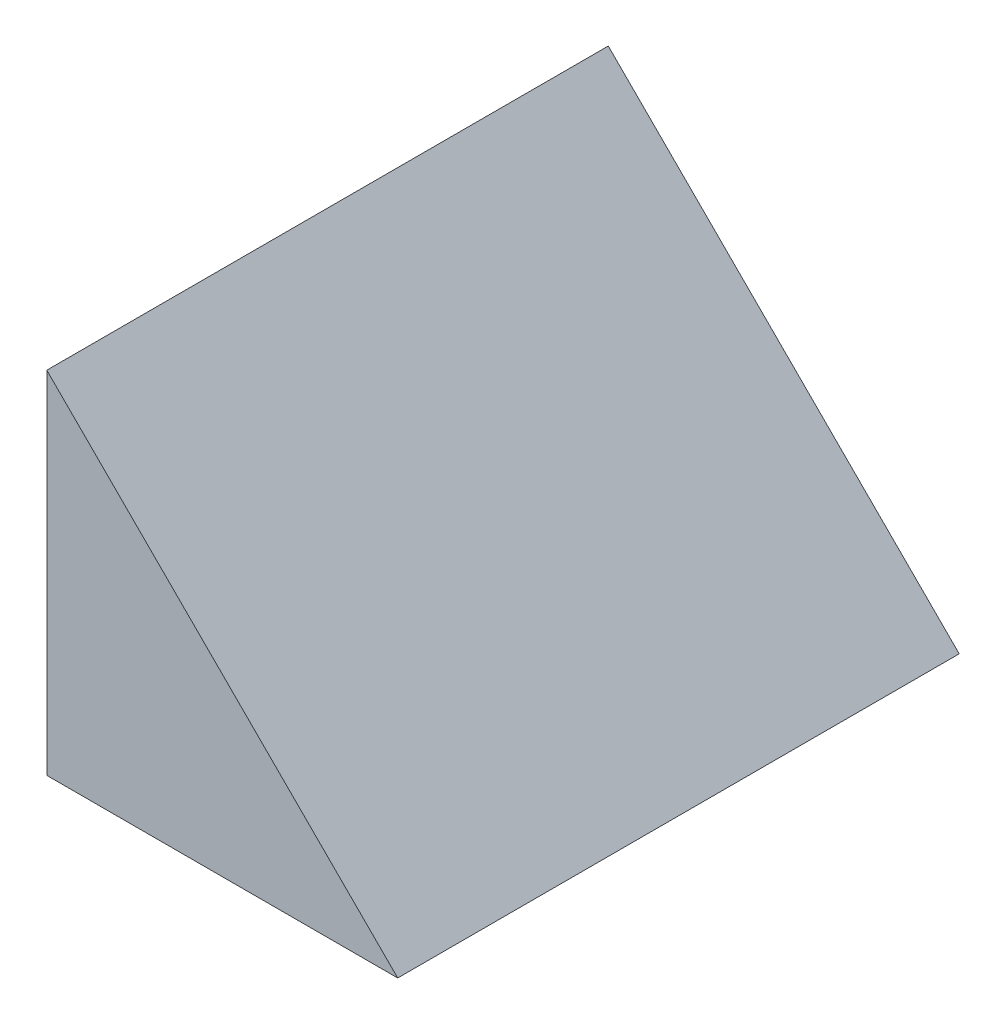
ISO-10303-21;
HEADER;
FILE_DESCRIPTION(('STEP AP214'),'2;1');
FILE_NAME('part.step','',(''),(''),'','','');
FILE_SCHEMA(('AUTOMOTIVE_DESIGN { 1 0 10303 214 1 1 1 1 }'));
ENDSEC;
DATA;
#1=APPLICATION_CONTEXT('core data for automotive mechanical design processes');
#2=APPLICATION_PROTOCOL_DEFINITION('international standard','automotive_design',2000,#1);
#3=PRODUCT_CONTEXT('',#1,'mechanical');
#4=PRODUCT('Part','Part','',(#3));
#5=PRODUCT_RELATED_PRODUCT_CATEGORY('part','',(#4));
#6=PRODUCT_DEFINITION_FORMATION('','',#4);
#7=PRODUCT_DEFINITION_CONTEXT('part definition',#1,'design');
#8=PRODUCT_DEFINITION('design','',#6,#7);
#9=PRODUCT_DEFINITION_SHAPE('','',#8);
#10=(LENGTH_UNIT() NAMED_UNIT(*) SI_UNIT(.MILLI.,.METRE.));
#11=(NAMED_UNIT(*) PLANE_ANGLE_UNIT() SI_UNIT($,.RADIAN.));
#12=(NAMED_UNIT(*) SI_UNIT($,.STERADIAN.) SOLID_ANGLE_UNIT());
#13=UNCERTAINTY_MEASURE_WITH_UNIT(LENGTH_MEASURE(1.E-05),#10,'distance_accuracy_value','');
#14=(GEOMETRIC_REPRESENTATION_CONTEXT(3) GLOBAL_UNCERTAINTY_ASSIGNED_CONTEXT((#13)) GLOBAL_UNIT_ASSIGNED_CONTEXT((#10,
#11,#12)) REPRESENTATION_CONTEXT('',''));
#15=CARTESIAN_POINT('',(0.,0.,0.));
#16=DIRECTION('',(0.,0.,1.));
#17=DIRECTION('',(1.,0.,0.));
#18=AXIS2_PLACEMENT_3D('',#15,#16,#17);
#19=CARTESIAN_POINT('',(0.,0.,0.4));
#20=DIRECTION('',(0.,1.,0.));
#21=DIRECTION('',(0.,0.,1.));
#22=AXIS2_PLACEMENT_3D('',#19,#20,#21);
#23=PLANE('',#22);
#24=DIRECTION('',(1.,0.,0.));
#25=VECTOR('',#24,1.);
#26=CARTESIAN_POINT('',(0.,0.,0.));
#27=LINE('',#26,#25);
#28=CARTESIAN_POINT('',(0.,0.,0.));
#29=VERTEX_POINT('',#28);
#30=CARTESIAN_POINT('',(0.25,0.,0.));
#31=VERTEX_POINT('',#30);
#32=EDGE_CURVE('E82',#29,#31,#27,.T.);
#33=ORIENTED_EDGE('',*,*,#32,.T.);
#34=DIRECTION('',(0.,0.,-1.));
#35=VECTOR('',#34,1.);
#36=CARTESIAN_POINT('',(0.25,0.,0.4));
#37=LINE('',#36,#35);
#38=CARTESIAN_POINT('',(0.25,0.,0.4));
#39=VERTEX_POINT('',#38);
#40=EDGE_CURVE('E11',#39,#31,#37,.T.);
#41=ORIENTED_EDGE('',*,*,#40,.F.);
#42=DIRECTION('',(1.,0.,0.));
#43=VECTOR('',#42,1.);
#44=CARTESIAN_POINT('',(0.,0.,0.4));
#45=LINE('',#44,#43);
#46=CARTESIAN_POINT('',(0.,0.,0.4));
#47=VERTEX_POINT('',#46);
#48=EDGE_CURVE('E75',#47,#39,#45,.T.);
#49=ORIENTED_EDGE('',*,*,#48,.F.);
#50=DIRECTION('',(0.,0.,-1.));
#51=VECTOR('',#50,1.);
#52=CARTESIAN_POINT('',(0.,0.,0.4));
#53=LINE('',#52,#51);
#54=EDGE_CURVE('E83',#47,#29,#53,.T.);
#55=ORIENTED_EDGE('',*,*,#54,.T.);
#56=EDGE_LOOP('',(#33,#41,#49,#55));
#57=FACE_BOUND('',#56,.T.);
#58=ADVANCED_FACE('F35',(#57),#23,.F.);
#59=CARTESIAN_POINT('',(0.,0.25,0.4));
#60=DIRECTION('',(-0.707106781186548,-0.707106781186548,0.));
#61=DIRECTION('',(0.707106781186548,-0.707106781186548,0.));
#62=AXIS2_PLACEMENT_3D('',#59,#60,#61);
#63=PLANE('',#62);
#64=DIRECTION('',(-0.707106781186548,0.707106781186548,0.));
#65=VECTOR('',#64,1.);
#66=CARTESIAN_POINT('',(0.,0.25,0.));
#67=LINE('',#66,#65);
#68=CARTESIAN_POINT('',(0.,0.25,0.));
#69=VERTEX_POINT('',#68);
#70=EDGE_CURVE('E63',#31,#69,#67,.T.);
#71=ORIENTED_EDGE('',*,*,#70,.T.);
#72=DIRECTION('',(0.,0.,-1.));
#73=VECTOR('',#72,1.);
#74=CARTESIAN_POINT('',(0.,0.25,0.4));
#75=LINE('',#74,#73);
#76=CARTESIAN_POINT('',(0.,0.25,0.4));
#77=VERTEX_POINT('',#76);
#78=EDGE_CURVE('E43',#77,#69,#75,.T.);
#79=ORIENTED_EDGE('',*,*,#78,.F.);
#80=DIRECTION('',(-0.707106781186548,0.707106781186548,0.));
#81=VECTOR('',#80,1.);
#82=CARTESIAN_POINT('',(0.,0.25,0.4));
#83=LINE('',#82,#81);
#84=EDGE_CURVE('E71',#39,#77,#83,.T.);
#85=ORIENTED_EDGE('',*,*,#84,.F.);
#86=ORIENTED_EDGE('',*,*,#40,.T.);
#87=EDGE_LOOP('',(#71,#79,#85,#86));
#88=FACE_BOUND('',#87,.T.);
#89=ADVANCED_FACE('F72',(#88),#63,.F.);
#90=CARTESIAN_POINT('',(0.,0.,0.4));
#91=DIRECTION('',(1.,0.,0.));
#92=DIRECTION('',(0.,0.,-1.));
#93=AXIS2_PLACEMENT_3D('',#90,#91,#92);
#94=PLANE('',#93);
#95=DIRECTION('',(0.,-1.,0.));
#96=VECTOR('',#95,1.);
#97=CARTESIAN_POINT('',(0.,0.,0.));
#98=LINE('',#97,#96);
#99=EDGE_CURVE('E68',#69,#29,#98,.T.);
#100=ORIENTED_EDGE('',*,*,#99,.T.);
#101=ORIENTED_EDGE('',*,*,#54,.F.);
#102=DIRECTION('',(0.,-1.,0.));
#103=VECTOR('',#102,1.);
#104=CARTESIAN_POINT('',(0.,0.,0.4));
#105=LINE('',#104,#103);
#106=EDGE_CURVE('E51',#77,#47,#105,.T.);
#107=ORIENTED_EDGE('',*,*,#106,.F.);
#108=ORIENTED_EDGE('',*,*,#78,.T.);
#109=EDGE_LOOP('',(#100,#101,#107,#108));
#110=FACE_BOUND('',#109,.T.);
#111=ADVANCED_FACE('F90',(#110),#94,.F.);
#112=CARTESIAN_POINT('',(0.,0.,0.4));
#113=DIRECTION('',(0.,0.,1.));
#114=DIRECTION('',(1.,0.,0.));
#115=AXIS2_PLACEMENT_3D('',#112,#113,#114);
#116=PLANE('',#115);
#117=ORIENTED_EDGE('',*,*,#48,.T.);
#118=ORIENTED_EDGE('',*,*,#84,.T.);
#119=ORIENTED_EDGE('',*,*,#106,.T.);
#120=EDGE_LOOP('',(#117,#118,#119));
#121=FACE_BOUND('',#120,.T.);
#122=ADVANCED_FACE('F78',(#121),#116,.T.);
#123=CARTESIAN_POINT('',(0.,0.,0.));
#124=DIRECTION('',(0.,0.,1.));
#125=DIRECTION('',(1.,0.,0.));
#126=AXIS2_PLACEMENT_3D('',#123,#124,#125);
#127=PLANE('',#126);
#128=ORIENTED_EDGE('',*,*,#32,.F.);
#129=ORIENTED_EDGE('',*,*,#99,.F.);
#130=ORIENTED_EDGE('',*,*,#70,.F.);
#131=EDGE_LOOP('',(#128,#129,#130));
#132=FACE_BOUND('',#131,.T.);
#133=ADVANCED_FACE('F91',(#132),#127,.F.);
#134=CLOSED_SHELL('',(#58,#89,#111,#122,#133));
#135=MANIFOLD_SOLID_BREP('B2',#134);
#136=ADVANCED_BREP_SHAPE_REPRESENTATION('',(#18,#135),#14);
#137=SHAPE_DEFINITION_REPRESENTATION(#9,#136);
ENDSEC;
END-ISO-10303-21;
